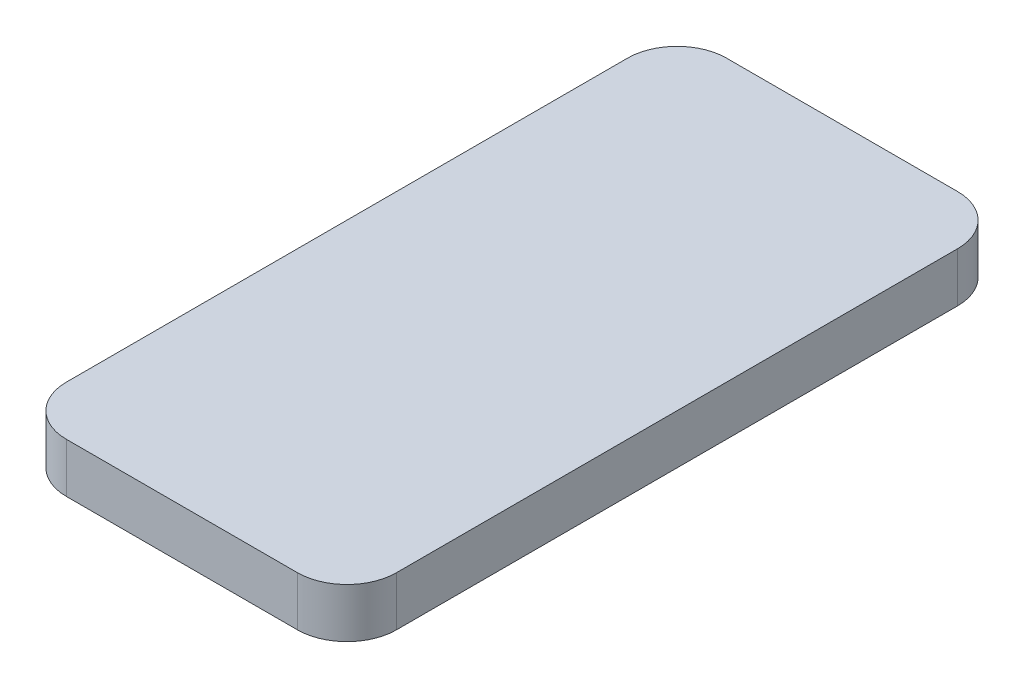
ISO-10303-21;
HEADER;
FILE_DESCRIPTION(('STEP AP214'),'2;1');
FILE_NAME('part.step','',(''),(''),'','','');
FILE_SCHEMA(('AUTOMOTIVE_DESIGN { 1 0 10303 214 1 1 1 1 }'));
ENDSEC;
DATA;
#1=APPLICATION_CONTEXT('core data for automotive mechanical design processes');
#2=APPLICATION_PROTOCOL_DEFINITION('international standard','automotive_design',2000,#1);
#3=PRODUCT_CONTEXT('',#1,'mechanical');
#4=PRODUCT('Part','Part','',(#3));
#5=PRODUCT_RELATED_PRODUCT_CATEGORY('part','',(#4));
#6=PRODUCT_DEFINITION_FORMATION('','',#4);
#7=PRODUCT_DEFINITION_CONTEXT('part definition',#1,'design');
#8=PRODUCT_DEFINITION('design','',#6,#7);
#9=PRODUCT_DEFINITION_SHAPE('','',#8);
#10=(LENGTH_UNIT() NAMED_UNIT(*) SI_UNIT(.MILLI.,.METRE.));
#11=(NAMED_UNIT(*) PLANE_ANGLE_UNIT() SI_UNIT($,.RADIAN.));
#12=(NAMED_UNIT(*) SI_UNIT($,.STERADIAN.) SOLID_ANGLE_UNIT());
#13=UNCERTAINTY_MEASURE_WITH_UNIT(LENGTH_MEASURE(1.E-05),#10,'distance_accuracy_value','');
#14=(GEOMETRIC_REPRESENTATION_CONTEXT(3) GLOBAL_UNCERTAINTY_ASSIGNED_CONTEXT((#13)) GLOBAL_UNIT_ASSIGNED_CONTEXT((#10,
#11,#12)) REPRESENTATION_CONTEXT('',''));
#15=CARTESIAN_POINT('',(0.,0.,0.));
#16=DIRECTION('',(0.,0.,1.));
#17=DIRECTION('',(1.,0.,0.));
#18=AXIS2_PLACEMENT_3D('',#15,#16,#17);
#19=CARTESIAN_POINT('',(0.,3.,0.));
#20=DIRECTION('',(1.,0.,0.));
#21=DIRECTION('',(0.,0.,-1.));
#22=AXIS2_PLACEMENT_3D('',#19,#20,#21);
#23=PLANE('',#22);
#24=DIRECTION('',(0.,0.,1.));
#25=VECTOR('',#24,1.);
#26=CARTESIAN_POINT('',(0.,3.,0.));
#27=LINE('',#26,#25);
#28=CARTESIAN_POINT('',(0.,3.,-37.));
#29=VERTEX_POINT('',#28);
#30=CARTESIAN_POINT('',(0.,3.,-3.));
#31=VERTEX_POINT('',#30);
#32=EDGE_CURVE('E131',#29,#31,#27,.T.);
#33=ORIENTED_EDGE('',*,*,#32,.F.);
#34=DIRECTION('',(0.,-1.,0.));
#35=VECTOR('',#34,1.);
#36=CARTESIAN_POINT('',(0.,3.,-37.));
#37=LINE('',#36,#35);
#38=CARTESIAN_POINT('',(0.,0.,-37.));
#39=VERTEX_POINT('',#38);
#40=EDGE_CURVE('E157',#29,#39,#37,.T.);
#41=ORIENTED_EDGE('',*,*,#40,.T.);
#42=DIRECTION('',(0.,0.,1.));
#43=VECTOR('',#42,1.);
#44=CARTESIAN_POINT('',(0.,0.,0.));
#45=LINE('',#44,#43);
#46=CARTESIAN_POINT('',(0.,0.,-3.));
#47=VERTEX_POINT('',#46);
#48=EDGE_CURVE('E163',#39,#47,#45,.T.);
#49=ORIENTED_EDGE('',*,*,#48,.T.);
#50=DIRECTION('',(0.,-1.,0.));
#51=VECTOR('',#50,1.);
#52=CARTESIAN_POINT('',(0.,3.,-3.));
#53=LINE('',#52,#51);
#54=EDGE_CURVE('E155',#47,#31,#53,.F.);
#55=ORIENTED_EDGE('',*,*,#54,.T.);
#56=EDGE_LOOP('',(#33,#41,#49,#55));
#57=FACE_BOUND('',#56,.T.);
#58=ADVANCED_FACE('F39',(#57),#23,.F.);
#59=CARTESIAN_POINT('',(0.,3.,0.));
#60=DIRECTION('',(0.,0.,-1.));
#61=DIRECTION('',(-1.,0.,0.));
#62=AXIS2_PLACEMENT_3D('',#59,#60,#61);
#63=PLANE('',#62);
#64=DIRECTION('',(1.,0.,0.));
#65=VECTOR('',#64,1.);
#66=CARTESIAN_POINT('',(0.,3.,0.));
#67=LINE('',#66,#65);
#68=CARTESIAN_POINT('',(3.,3.,0.));
#69=VERTEX_POINT('',#68);
#70=CARTESIAN_POINT('',(17.,3.,0.));
#71=VERTEX_POINT('',#70);
#72=EDGE_CURVE('E134',#69,#71,#67,.T.);
#73=ORIENTED_EDGE('',*,*,#72,.F.);
#74=DIRECTION('',(0.,-1.,0.));
#75=VECTOR('',#74,1.);
#76=CARTESIAN_POINT('',(3.,3.,0.));
#77=LINE('',#76,#75);
#78=CARTESIAN_POINT('',(3.,0.,0.));
#79=VERTEX_POINT('',#78);
#80=EDGE_CURVE('E11',#69,#79,#77,.T.);
#81=ORIENTED_EDGE('',*,*,#80,.T.);
#82=DIRECTION('',(1.,0.,0.));
#83=VECTOR('',#82,1.);
#84=CARTESIAN_POINT('',(0.,0.,0.));
#85=LINE('',#84,#83);
#86=CARTESIAN_POINT('',(17.,0.,0.));
#87=VERTEX_POINT('',#86);
#88=EDGE_CURVE('E136',#79,#87,#85,.T.);
#89=ORIENTED_EDGE('',*,*,#88,.T.);
#90=DIRECTION('',(0.,-1.,0.));
#91=VECTOR('',#90,1.);
#92=CARTESIAN_POINT('',(17.,3.,0.));
#93=LINE('',#92,#91);
#94=EDGE_CURVE('E47',#87,#71,#93,.F.);
#95=ORIENTED_EDGE('',*,*,#94,.T.);
#96=EDGE_LOOP('',(#73,#81,#89,#95));
#97=FACE_BOUND('',#96,.T.);
#98=ADVANCED_FACE('F182',(#97),#63,.F.);
#99=CARTESIAN_POINT('',(20.,3.,0.));
#100=DIRECTION('',(-1.,0.,0.));
#101=DIRECTION('',(0.,0.,1.));
#102=AXIS2_PLACEMENT_3D('',#99,#100,#101);
#103=PLANE('',#102);
#104=DIRECTION('',(0.,0.,-1.));
#105=VECTOR('',#104,1.);
#106=CARTESIAN_POINT('',(20.,0.,0.));
#107=LINE('',#106,#105);
#108=CARTESIAN_POINT('',(20.,0.,-3.));
#109=VERTEX_POINT('',#108);
#110=CARTESIAN_POINT('',(20.,0.,-37.));
#111=VERTEX_POINT('',#110);
#112=EDGE_CURVE('E132',#109,#111,#107,.T.);
#113=ORIENTED_EDGE('',*,*,#112,.T.);
#114=DIRECTION('',(0.,-1.,0.));
#115=VECTOR('',#114,1.);
#116=CARTESIAN_POINT('',(20.,3.,-37.));
#117=LINE('',#116,#115);
#118=CARTESIAN_POINT('',(20.,3.,-37.));
#119=VERTEX_POINT('',#118);
#120=EDGE_CURVE('E110',#111,#119,#117,.F.);
#121=ORIENTED_EDGE('',*,*,#120,.T.);
#122=DIRECTION('',(0.,0.,-1.));
#123=VECTOR('',#122,1.);
#124=CARTESIAN_POINT('',(20.,3.,0.));
#125=LINE('',#124,#123);
#126=CARTESIAN_POINT('',(20.,3.,-3.));
#127=VERTEX_POINT('',#126);
#128=EDGE_CURVE('E171',#127,#119,#125,.T.);
#129=ORIENTED_EDGE('',*,*,#128,.F.);
#130=DIRECTION('',(0.,-1.,0.));
#131=VECTOR('',#130,1.);
#132=CARTESIAN_POINT('',(20.,3.,-3.));
#133=LINE('',#132,#131);
#134=EDGE_CURVE('E115',#127,#109,#133,.T.);
#135=ORIENTED_EDGE('',*,*,#134,.T.);
#136=EDGE_LOOP('',(#113,#121,#129,#135));
#137=FACE_BOUND('',#136,.T.);
#138=ADVANCED_FACE('F181',(#137),#103,.F.);
#139=CARTESIAN_POINT('',(0.,3.,-40.));
#140=DIRECTION('',(0.,0.,1.));
#141=DIRECTION('',(1.,0.,0.));
#142=AXIS2_PLACEMENT_3D('',#139,#140,#141);
#143=PLANE('',#142);
#144=DIRECTION('',(-1.,0.,0.));
#145=VECTOR('',#144,1.);
#146=CARTESIAN_POINT('',(0.,3.,-40.));
#147=LINE('',#146,#145);
#148=CARTESIAN_POINT('',(17.,3.,-40.));
#149=VERTEX_POINT('',#148);
#150=CARTESIAN_POINT('',(3.,3.,-40.));
#151=VERTEX_POINT('',#150);
#152=EDGE_CURVE('E125',#149,#151,#147,.T.);
#153=ORIENTED_EDGE('',*,*,#152,.F.);
#154=DIRECTION('',(0.,-1.,0.));
#155=VECTOR('',#154,1.);
#156=CARTESIAN_POINT('',(17.,3.,-40.));
#157=LINE('',#156,#155);
#158=CARTESIAN_POINT('',(17.,0.,-40.));
#159=VERTEX_POINT('',#158);
#160=EDGE_CURVE('E109',#149,#159,#157,.T.);
#161=ORIENTED_EDGE('',*,*,#160,.T.);
#162=DIRECTION('',(-1.,0.,0.));
#163=VECTOR('',#162,1.);
#164=CARTESIAN_POINT('',(0.,0.,-40.));
#165=LINE('',#164,#163);
#166=CARTESIAN_POINT('',(3.,0.,-40.));
#167=VERTEX_POINT('',#166);
#168=EDGE_CURVE('E122',#159,#167,#165,.T.);
#169=ORIENTED_EDGE('',*,*,#168,.T.);
#170=DIRECTION('',(0.,-1.,0.));
#171=VECTOR('',#170,1.);
#172=CARTESIAN_POINT('',(3.,3.,-40.));
#173=LINE('',#172,#171);
#174=EDGE_CURVE('E127',#167,#151,#173,.F.);
#175=ORIENTED_EDGE('',*,*,#174,.T.);
#176=EDGE_LOOP('',(#153,#161,#169,#175));
#177=FACE_BOUND('',#176,.T.);
#178=ADVANCED_FACE('F121',(#177),#143,.F.);
#179=CARTESIAN_POINT('',(0.,3.,0.));
#180=DIRECTION('',(0.,-1.,0.));
#181=DIRECTION('',(0.,0.,-1.));
#182=AXIS2_PLACEMENT_3D('',#179,#180,#181);
#183=PLANE('',#182);
#184=ORIENTED_EDGE('',*,*,#128,.T.);
#185=CARTESIAN_POINT('',(17.,3.,-37.));
#186=DIRECTION('',(0.,-1.,0.));
#187=DIRECTION('',(0.,0.,-1.));
#188=AXIS2_PLACEMENT_3D('',#185,#186,#187);
#189=CIRCLE('',#188,3.);
#190=EDGE_CURVE('E153',#119,#149,#189,.F.);
#191=ORIENTED_EDGE('',*,*,#190,.T.);
#192=ORIENTED_EDGE('',*,*,#152,.T.);
#193=CARTESIAN_POINT('',(3.,3.,-37.));
#194=DIRECTION('',(0.,-1.,0.));
#195=DIRECTION('',(0.,0.,-1.));
#196=AXIS2_PLACEMENT_3D('',#193,#194,#195);
#197=CIRCLE('',#196,3.);
#198=EDGE_CURVE('E151',#151,#29,#197,.F.);
#199=ORIENTED_EDGE('',*,*,#198,.T.);
#200=ORIENTED_EDGE('',*,*,#32,.T.);
#201=CARTESIAN_POINT('',(3.,3.,-3.));
#202=DIRECTION('',(0.,-1.,0.));
#203=DIRECTION('',(0.,0.,-1.));
#204=AXIS2_PLACEMENT_3D('',#201,#202,#203);
#205=CIRCLE('',#204,3.);
#206=EDGE_CURVE('E60',#31,#69,#205,.F.);
#207=ORIENTED_EDGE('',*,*,#206,.T.);
#208=ORIENTED_EDGE('',*,*,#72,.T.);
#209=CARTESIAN_POINT('',(17.,3.,-3.));
#210=DIRECTION('',(0.,-1.,0.));
#211=DIRECTION('',(0.,0.,-1.));
#212=AXIS2_PLACEMENT_3D('',#209,#210,#211);
#213=CIRCLE('',#212,3.);
#214=EDGE_CURVE('E148',#71,#127,#213,.F.);
#215=ORIENTED_EDGE('',*,*,#214,.T.);
#216=EDGE_LOOP('',(#184,#191,#192,#199,#200,#207,#208,#215));
#217=FACE_BOUND('',#216,.T.);
#218=ADVANCED_FACE('F175',(#217),#183,.F.);
#219=CARTESIAN_POINT('',(0.,0.,0.));
#220=DIRECTION('',(0.,-1.,0.));
#221=DIRECTION('',(0.,0.,-1.));
#222=AXIS2_PLACEMENT_3D('',#219,#220,#221);
#223=PLANE('',#222);
#224=ORIENTED_EDGE('',*,*,#168,.F.);
#225=CARTESIAN_POINT('',(17.,0.,-37.));
#226=DIRECTION('',(0.,-1.,0.));
#227=DIRECTION('',(0.,0.,-1.));
#228=AXIS2_PLACEMENT_3D('',#225,#226,#227);
#229=CIRCLE('',#228,3.);
#230=EDGE_CURVE('E105',#159,#111,#229,.T.);
#231=ORIENTED_EDGE('',*,*,#230,.T.);
#232=ORIENTED_EDGE('',*,*,#112,.F.);
#233=CARTESIAN_POINT('',(17.,0.,-3.));
#234=DIRECTION('',(0.,-1.,0.));
#235=DIRECTION('',(0.,0.,-1.));
#236=AXIS2_PLACEMENT_3D('',#233,#234,#235);
#237=CIRCLE('',#236,3.);
#238=EDGE_CURVE('E126',#109,#87,#237,.T.);
#239=ORIENTED_EDGE('',*,*,#238,.T.);
#240=ORIENTED_EDGE('',*,*,#88,.F.);
#241=CARTESIAN_POINT('',(3.,0.,-3.));
#242=DIRECTION('',(0.,-1.,0.));
#243=DIRECTION('',(0.,0.,-1.));
#244=AXIS2_PLACEMENT_3D('',#241,#242,#243);
#245=CIRCLE('',#244,3.);
#246=EDGE_CURVE('E142',#79,#47,#245,.T.);
#247=ORIENTED_EDGE('',*,*,#246,.T.);
#248=ORIENTED_EDGE('',*,*,#48,.F.);
#249=CARTESIAN_POINT('',(3.,0.,-37.));
#250=DIRECTION('',(0.,-1.,0.));
#251=DIRECTION('',(0.,0.,-1.));
#252=AXIS2_PLACEMENT_3D('',#249,#250,#251);
#253=CIRCLE('',#252,3.);
#254=EDGE_CURVE('E116',#39,#167,#253,.T.);
#255=ORIENTED_EDGE('',*,*,#254,.T.);
#256=EDGE_LOOP('',(#224,#231,#232,#239,#240,#247,#248,#255));
#257=FACE_BOUND('',#256,.T.);
#258=ADVANCED_FACE('F129',(#257),#223,.T.);
#259=CARTESIAN_POINT('',(17.,3.,-37.));
#260=DIRECTION('',(0.,-1.,0.));
#261=DIRECTION('',(0.,0.,-1.));
#262=AXIS2_PLACEMENT_3D('',#259,#260,#261);
#263=CYLINDRICAL_SURFACE('',#262,3.);
#264=ORIENTED_EDGE('',*,*,#190,.F.);
#265=ORIENTED_EDGE('',*,*,#120,.F.);
#266=ORIENTED_EDGE('',*,*,#230,.F.);
#267=ORIENTED_EDGE('',*,*,#160,.F.);
#268=EDGE_LOOP('',(#264,#265,#266,#267));
#269=FACE_BOUND('',#268,.T.);
#270=ADVANCED_FACE('F108',(#269),#263,.T.);
#271=CARTESIAN_POINT('',(3.,3.,-37.));
#272=DIRECTION('',(0.,-1.,0.));
#273=DIRECTION('',(0.,0.,-1.));
#274=AXIS2_PLACEMENT_3D('',#271,#272,#273);
#275=CYLINDRICAL_SURFACE('',#274,3.);
#276=ORIENTED_EDGE('',*,*,#198,.F.);
#277=ORIENTED_EDGE('',*,*,#174,.F.);
#278=ORIENTED_EDGE('',*,*,#254,.F.);
#279=ORIENTED_EDGE('',*,*,#40,.F.);
#280=EDGE_LOOP('',(#276,#277,#278,#279));
#281=FACE_BOUND('',#280,.T.);
#282=ADVANCED_FACE('F185',(#281),#275,.T.);
#283=CARTESIAN_POINT('',(3.,3.,-3.));
#284=DIRECTION('',(0.,-1.,0.));
#285=DIRECTION('',(0.,0.,-1.));
#286=AXIS2_PLACEMENT_3D('',#283,#284,#285);
#287=CYLINDRICAL_SURFACE('',#286,3.);
#288=ORIENTED_EDGE('',*,*,#206,.F.);
#289=ORIENTED_EDGE('',*,*,#54,.F.);
#290=ORIENTED_EDGE('',*,*,#246,.F.);
#291=ORIENTED_EDGE('',*,*,#80,.F.);
#292=EDGE_LOOP('',(#288,#289,#290,#291));
#293=FACE_BOUND('',#292,.T.);
#294=ADVANCED_FACE('F184',(#293),#287,.T.);
#295=CARTESIAN_POINT('',(17.,3.,-3.));
#296=DIRECTION('',(0.,-1.,0.));
#297=DIRECTION('',(0.,0.,-1.));
#298=AXIS2_PLACEMENT_3D('',#295,#296,#297);
#299=CYLINDRICAL_SURFACE('',#298,3.);
#300=ORIENTED_EDGE('',*,*,#214,.F.);
#301=ORIENTED_EDGE('',*,*,#94,.F.);
#302=ORIENTED_EDGE('',*,*,#238,.F.);
#303=ORIENTED_EDGE('',*,*,#134,.F.);
#304=EDGE_LOOP('',(#300,#301,#302,#303));
#305=FACE_BOUND('',#304,.T.);
#306=ADVANCED_FACE('F41',(#305),#299,.T.);
#307=CLOSED_SHELL('',(#58,#98,#138,#178,#218,#258,#270,#282,#294,#306));
#308=MANIFOLD_SOLID_BREP('B2',#307);
#309=ADVANCED_BREP_SHAPE_REPRESENTATION('',(#18,#308),#14);
#310=SHAPE_DEFINITION_REPRESENTATION(#9,#309);
ENDSEC;
END-ISO-10303-21;
